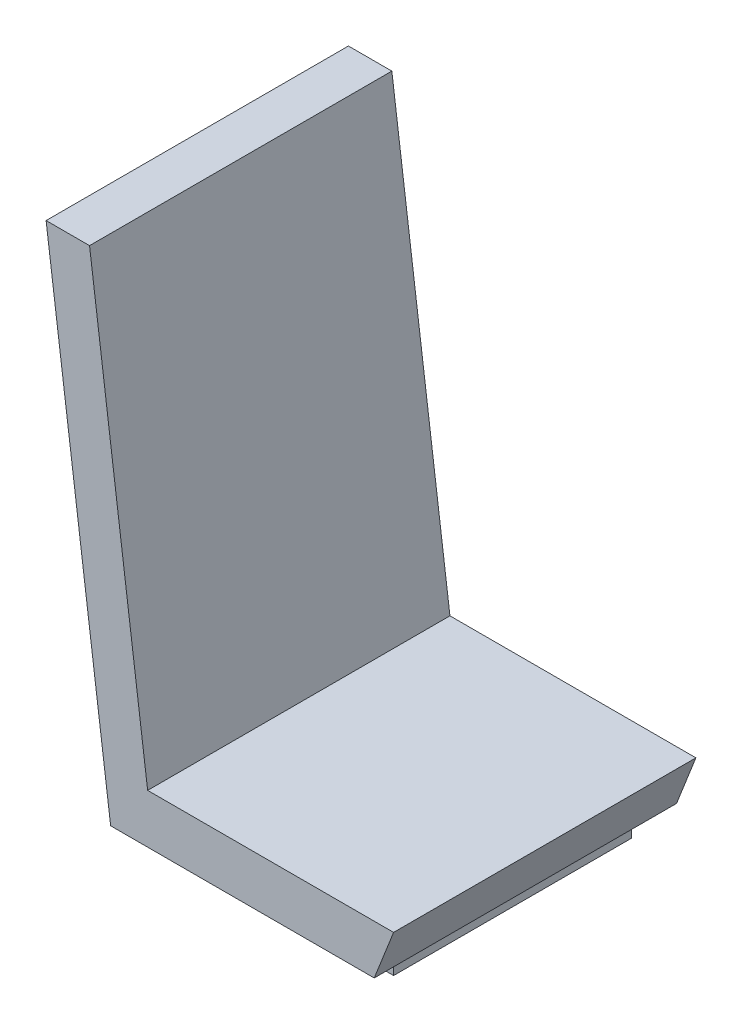
ISO-10303-21;
HEADER;
FILE_DESCRIPTION(('STEP AP214'),'2;1');
FILE_NAME('part.step','',(''),(''),'','','');
FILE_SCHEMA(('AUTOMOTIVE_DESIGN { 1 0 10303 214 1 1 1 1 }'));
ENDSEC;
DATA;
#1=APPLICATION_CONTEXT('core data for automotive mechanical design processes');
#2=APPLICATION_PROTOCOL_DEFINITION('international standard','automotive_design',2000,#1);
#3=PRODUCT_CONTEXT('',#1,'mechanical');
#4=PRODUCT('Part','Part','',(#3));
#5=PRODUCT_RELATED_PRODUCT_CATEGORY('part','',(#4));
#6=PRODUCT_DEFINITION_FORMATION('','',#4);
#7=PRODUCT_DEFINITION_CONTEXT('part definition',#1,'design');
#8=PRODUCT_DEFINITION('design','',#6,#7);
#9=PRODUCT_DEFINITION_SHAPE('','',#8);
#10=(LENGTH_UNIT() NAMED_UNIT(*) SI_UNIT(.MILLI.,.METRE.));
#11=(NAMED_UNIT(*) PLANE_ANGLE_UNIT() SI_UNIT($,.RADIAN.));
#12=(NAMED_UNIT(*) SI_UNIT($,.STERADIAN.) SOLID_ANGLE_UNIT());
#13=UNCERTAINTY_MEASURE_WITH_UNIT(LENGTH_MEASURE(1.E-05),#10,'distance_accuracy_value','');
#14=(GEOMETRIC_REPRESENTATION_CONTEXT(3) GLOBAL_UNCERTAINTY_ASSIGNED_CONTEXT((#13)) GLOBAL_UNIT_ASSIGNED_CONTEXT((#10,
#11,#12)) REPRESENTATION_CONTEXT('',''));
#15=CARTESIAN_POINT('',(0.,0.,0.));
#16=DIRECTION('',(0.,0.,1.));
#17=DIRECTION('',(1.,0.,0.));
#18=AXIS2_PLACEMENT_3D('',#15,#16,#17);
#19=CARTESIAN_POINT('',(0.,0.,368.3));
#20=DIRECTION('',(0.,1.,0.));
#21=DIRECTION('',(0.,0.,1.));
#22=AXIS2_PLACEMENT_3D('',#19,#20,#21);
#23=PLANE('',#22);
#24=DIRECTION('',(1.,0.,0.));
#25=VECTOR('',#24,1.);
#26=CARTESIAN_POINT('',(0.,0.,0.));
#27=LINE('',#26,#25);
#28=CARTESIAN_POINT('',(0.,0.,0.));
#29=VERTEX_POINT('',#28);
#30=CARTESIAN_POINT('',(368.3,0.,0.));
#31=VERTEX_POINT('',#30);
#32=EDGE_CURVE('E283',#29,#31,#27,.T.);
#33=ORIENTED_EDGE('',*,*,#32,.T.);
#34=DIRECTION('',(0.,0.,-1.));
#35=VECTOR('',#34,1.);
#36=CARTESIAN_POINT('',(368.3,0.,368.3));
#37=LINE('',#36,#35);
#38=CARTESIAN_POINT('',(368.3,0.,368.3));
#39=VERTEX_POINT('',#38);
#40=EDGE_CURVE('E54',#39,#31,#37,.T.);
#41=ORIENTED_EDGE('',*,*,#40,.F.);
#42=DIRECTION('',(1.,0.,0.));
#43=VECTOR('',#42,1.);
#44=CARTESIAN_POINT('',(0.,0.,368.3));
#45=LINE('',#44,#43);
#46=CARTESIAN_POINT('',(0.,0.,368.3));
#47=VERTEX_POINT('',#46);
#48=EDGE_CURVE('E269',#47,#39,#45,.T.);
#49=ORIENTED_EDGE('',*,*,#48,.F.);
#50=DIRECTION('',(0.,0.,-1.));
#51=VECTOR('',#50,1.);
#52=CARTESIAN_POINT('',(0.,0.,368.3));
#53=LINE('',#52,#51);
#54=EDGE_CURVE('E11',#47,#29,#53,.T.);
#55=ORIENTED_EDGE('',*,*,#54,.T.);
#56=EDGE_LOOP('',(#33,#41,#49,#55));
#57=FACE_BOUND('',#56,.T.);
#58=DIRECTION('',(1.,0.,0.));
#59=VECTOR('',#58,1.);
#60=CARTESIAN_POINT('',(0.,0.,31.75));
#61=LINE('',#60,#59);
#62=CARTESIAN_POINT('',(31.75,0.,31.75));
#63=VERTEX_POINT('',#62);
#64=CARTESIAN_POINT('',(336.55,0.,31.75));
#65=VERTEX_POINT('',#64);
#66=EDGE_CURVE('E228',#63,#65,#61,.T.);
#67=ORIENTED_EDGE('',*,*,#66,.F.);
#68=DIRECTION('',(0.,0.,-1.));
#69=VECTOR('',#68,1.);
#70=CARTESIAN_POINT('',(31.75,0.,368.3));
#71=LINE('',#70,#69);
#72=CARTESIAN_POINT('',(31.75,0.,336.55));
#73=VERTEX_POINT('',#72);
#74=EDGE_CURVE('E239',#73,#63,#71,.T.);
#75=ORIENTED_EDGE('',*,*,#74,.F.);
#76=DIRECTION('',(1.,0.,0.));
#77=VECTOR('',#76,1.);
#78=CARTESIAN_POINT('',(0.,0.,336.55));
#79=LINE('',#78,#77);
#80=CARTESIAN_POINT('',(336.55,0.,336.55));
#81=VERTEX_POINT('',#80);
#82=EDGE_CURVE('E231',#73,#81,#79,.T.);
#83=ORIENTED_EDGE('',*,*,#82,.T.);
#84=DIRECTION('',(0.,0.,-1.));
#85=VECTOR('',#84,1.);
#86=CARTESIAN_POINT('',(336.55,0.,368.3));
#87=LINE('',#86,#85);
#88=EDGE_CURVE('E243',#81,#65,#87,.T.);
#89=ORIENTED_EDGE('',*,*,#88,.T.);
#90=EDGE_LOOP('',(#67,#75,#83,#89));
#91=FACE_BOUND('',#90,.T.);
#92=ADVANCED_FACE('F45',(#57,#91),#23,.F.);
#93=CARTESIAN_POINT('',(0.,0.,368.3));
#94=DIRECTION('',(1.,0.,0.));
#95=DIRECTION('',(0.,0.,-1.));
#96=AXIS2_PLACEMENT_3D('',#93,#94,#95);
#97=PLANE('',#96);
#98=DIRECTION('',(0.,-1.,0.));
#99=VECTOR('',#98,1.);
#100=CARTESIAN_POINT('',(0.,0.,0.));
#101=LINE('',#100,#99);
#102=CARTESIAN_POINT('',(0.,31.75,0.));
#103=VERTEX_POINT('',#102);
#104=EDGE_CURVE('E242',#103,#29,#101,.T.);
#105=ORIENTED_EDGE('',*,*,#104,.T.);
#106=ORIENTED_EDGE('',*,*,#54,.F.);
#107=DIRECTION('',(0.,-1.,0.));
#108=VECTOR('',#107,1.);
#109=CARTESIAN_POINT('',(0.,0.,368.3));
#110=LINE('',#109,#108);
#111=CARTESIAN_POINT('',(0.,31.75,368.3));
#112=VERTEX_POINT('',#111);
#113=EDGE_CURVE('E265',#112,#47,#110,.T.);
#114=ORIENTED_EDGE('',*,*,#113,.F.);
#115=DIRECTION('',(0.,0.,-1.));
#116=VECTOR('',#115,1.);
#117=CARTESIAN_POINT('',(0.,31.75,368.3));
#118=LINE('',#117,#116);
#119=EDGE_CURVE('E279',#112,#103,#118,.T.);
#120=ORIENTED_EDGE('',*,*,#119,.T.);
#121=EDGE_LOOP('',(#105,#106,#114,#120));
#122=FACE_BOUND('',#121,.T.);
#123=ADVANCED_FACE('F47',(#122),#97,.F.);
#124=CARTESIAN_POINT('',(368.3,31.75,368.3));
#125=DIRECTION('',(-1.,0.,0.));
#126=DIRECTION('',(0.,0.,1.));
#127=AXIS2_PLACEMENT_3D('',#124,#125,#126);
#128=PLANE('',#127);
#129=DIRECTION('',(0.,1.,0.));
#130=VECTOR('',#129,1.);
#131=CARTESIAN_POINT('',(368.3,31.75,0.));
#132=LINE('',#131,#130);
#133=CARTESIAN_POINT('',(368.3,31.75,0.));
#134=VERTEX_POINT('',#133);
#135=EDGE_CURVE('E286',#31,#134,#132,.T.);
#136=ORIENTED_EDGE('',*,*,#135,.T.);
#137=DIRECTION('',(0.,0.,-1.));
#138=VECTOR('',#137,1.);
#139=CARTESIAN_POINT('',(368.3,31.75,368.3));
#140=LINE('',#139,#138);
#141=CARTESIAN_POINT('',(368.3,31.75,368.3));
#142=VERTEX_POINT('',#141);
#143=EDGE_CURVE('E295',#142,#134,#140,.T.);
#144=ORIENTED_EDGE('',*,*,#143,.F.);
#145=DIRECTION('',(0.,1.,0.));
#146=VECTOR('',#145,1.);
#147=CARTESIAN_POINT('',(368.3,31.75,368.3));
#148=LINE('',#147,#146);
#149=EDGE_CURVE('E273',#39,#142,#148,.T.);
#150=ORIENTED_EDGE('',*,*,#149,.F.);
#151=ORIENTED_EDGE('',*,*,#40,.T.);
#152=EDGE_LOOP('',(#136,#144,#150,#151));
#153=FACE_BOUND('',#152,.T.);
#154=ADVANCED_FACE('F304',(#153),#128,.F.);
#155=CARTESIAN_POINT('',(0.,0.,368.3));
#156=DIRECTION('',(0.,0.,-1.));
#157=DIRECTION('',(-1.,0.,0.));
#158=AXIS2_PLACEMENT_3D('',#155,#156,#157);
#159=PLANE('',#158);
#160=ORIENTED_EDGE('',*,*,#113,.T.);
#161=ORIENTED_EDGE('',*,*,#48,.T.);
#162=ORIENTED_EDGE('',*,*,#149,.T.);
#163=DIRECTION('',(-1.,0.,0.));
#164=VECTOR('',#163,1.);
#165=CARTESIAN_POINT('',(0.,31.75,368.3));
#166=LINE('',#165,#164);
#167=EDGE_CURVE('E276',#142,#112,#166,.T.);
#168=ORIENTED_EDGE('',*,*,#167,.T.);
#169=EDGE_LOOP('',(#160,#161,#162,#168));
#170=FACE_BOUND('',#169,.T.);
#171=ADVANCED_FACE('F315',(#170),#159,.F.);
#172=CARTESIAN_POINT('',(0.,0.,0.));
#173=DIRECTION('',(0.,0.,-1.));
#174=DIRECTION('',(-1.,0.,0.));
#175=AXIS2_PLACEMENT_3D('',#172,#173,#174);
#176=PLANE('',#175);
#177=ORIENTED_EDGE('',*,*,#104,.F.);
#178=DIRECTION('',(-1.,0.,0.));
#179=VECTOR('',#178,1.);
#180=CARTESIAN_POINT('',(0.,31.75,0.));
#181=LINE('',#180,#179);
#182=EDGE_CURVE('E270',#134,#103,#181,.T.);
#183=ORIENTED_EDGE('',*,*,#182,.F.);
#184=ORIENTED_EDGE('',*,*,#135,.F.);
#185=ORIENTED_EDGE('',*,*,#32,.F.);
#186=EDGE_LOOP('',(#177,#183,#184,#185));
#187=FACE_BOUND('',#186,.T.);
#188=ADVANCED_FACE('F309',(#187),#176,.T.);
#189=CARTESIAN_POINT('',(31.75,0.,368.3));
#190=DIRECTION('',(1.,0.,0.));
#191=DIRECTION('',(0.,0.,-1.));
#192=AXIS2_PLACEMENT_3D('',#189,#190,#191);
#193=PLANE('',#192);
#194=DIRECTION('',(0.,-1.,0.));
#195=VECTOR('',#194,1.);
#196=CARTESIAN_POINT('',(31.75,0.,31.75));
#197=LINE('',#196,#195);
#198=CARTESIAN_POINT('',(31.75,31.75,31.75));
#199=VERTEX_POINT('',#198);
#200=EDGE_CURVE('E213',#199,#63,#197,.T.);
#201=ORIENTED_EDGE('',*,*,#200,.F.);
#202=DIRECTION('',(0.,0.,-1.));
#203=VECTOR('',#202,1.);
#204=CARTESIAN_POINT('',(31.75,31.75,368.3));
#205=LINE('',#204,#203);
#206=CARTESIAN_POINT('',(31.75,31.75,336.55));
#207=VERTEX_POINT('',#206);
#208=EDGE_CURVE('E253',#207,#199,#205,.T.);
#209=ORIENTED_EDGE('',*,*,#208,.F.);
#210=DIRECTION('',(0.,-1.,0.));
#211=VECTOR('',#210,1.);
#212=CARTESIAN_POINT('',(31.75,0.,336.55));
#213=LINE('',#212,#211);
#214=EDGE_CURVE('E61',#207,#73,#213,.T.);
#215=ORIENTED_EDGE('',*,*,#214,.T.);
#216=ORIENTED_EDGE('',*,*,#74,.T.);
#217=EDGE_LOOP('',(#201,#209,#215,#216));
#218=FACE_BOUND('',#217,.T.);
#219=ADVANCED_FACE('F331',(#218),#193,.T.);
#220=CARTESIAN_POINT('',(336.55,31.75,368.3));
#221=DIRECTION('',(-1.,0.,0.));
#222=DIRECTION('',(0.,0.,1.));
#223=AXIS2_PLACEMENT_3D('',#220,#221,#222);
#224=PLANE('',#223);
#225=DIRECTION('',(0.,1.,0.));
#226=VECTOR('',#225,1.);
#227=CARTESIAN_POINT('',(336.55,0.,31.75));
#228=LINE('',#227,#226);
#229=CARTESIAN_POINT('',(336.55,31.75,31.75));
#230=VERTEX_POINT('',#229);
#231=EDGE_CURVE('E236',#65,#230,#228,.T.);
#232=ORIENTED_EDGE('',*,*,#231,.F.);
#233=ORIENTED_EDGE('',*,*,#88,.F.);
#234=DIRECTION('',(0.,1.,0.));
#235=VECTOR('',#234,1.);
#236=CARTESIAN_POINT('',(336.55,0.,336.55));
#237=LINE('',#236,#235);
#238=CARTESIAN_POINT('',(336.55,31.75,336.55));
#239=VERTEX_POINT('',#238);
#240=EDGE_CURVE('E233',#81,#239,#237,.T.);
#241=ORIENTED_EDGE('',*,*,#240,.T.);
#242=DIRECTION('',(0.,0.,-1.));
#243=VECTOR('',#242,1.);
#244=CARTESIAN_POINT('',(336.55,31.75,368.3));
#245=LINE('',#244,#243);
#246=EDGE_CURVE('E249',#239,#230,#245,.T.);
#247=ORIENTED_EDGE('',*,*,#246,.T.);
#248=EDGE_LOOP('',(#232,#233,#241,#247));
#249=FACE_BOUND('',#248,.T.);
#250=ADVANCED_FACE('F326',(#249),#224,.T.);
#251=CARTESIAN_POINT('',(0.,0.,336.55));
#252=DIRECTION('',(0.,0.,-1.));
#253=DIRECTION('',(-1.,0.,0.));
#254=AXIS2_PLACEMENT_3D('',#251,#252,#253);
#255=PLANE('',#254);
#256=ORIENTED_EDGE('',*,*,#214,.F.);
#257=DIRECTION('',(-1.,0.,0.));
#258=VECTOR('',#257,1.);
#259=CARTESIAN_POINT('',(0.,31.75,336.55));
#260=LINE('',#259,#258);
#261=EDGE_CURVE('E68',#239,#207,#260,.T.);
#262=ORIENTED_EDGE('',*,*,#261,.F.);
#263=ORIENTED_EDGE('',*,*,#240,.F.);
#264=ORIENTED_EDGE('',*,*,#82,.F.);
#265=EDGE_LOOP('',(#256,#262,#263,#264));
#266=FACE_BOUND('',#265,.T.);
#267=ADVANCED_FACE('F332',(#266),#255,.T.);
#268=CARTESIAN_POINT('',(0.,0.,31.75));
#269=DIRECTION('',(0.,0.,-1.));
#270=DIRECTION('',(-1.,0.,0.));
#271=AXIS2_PLACEMENT_3D('',#268,#269,#270);
#272=PLANE('',#271);
#273=ORIENTED_EDGE('',*,*,#200,.T.);
#274=ORIENTED_EDGE('',*,*,#66,.T.);
#275=ORIENTED_EDGE('',*,*,#231,.T.);
#276=DIRECTION('',(-1.,0.,0.));
#277=VECTOR('',#276,1.);
#278=CARTESIAN_POINT('',(0.,31.75,31.75));
#279=LINE('',#278,#277);
#280=EDGE_CURVE('E232',#230,#199,#279,.T.);
#281=ORIENTED_EDGE('',*,*,#280,.T.);
#282=EDGE_LOOP('',(#273,#274,#275,#281));
#283=FACE_BOUND('',#282,.T.);
#284=ADVANCED_FACE('F324',(#283),#272,.F.);
#285=CARTESIAN_POINT('',(0.,31.75,-50.));
#286=DIRECTION('',(0.,-1.,0.));
#287=DIRECTION('',(0.,0.,-1.));
#288=AXIS2_PLACEMENT_3D('',#285,#286,#287);
#289=PLANE('',#288);
#290=ORIENTED_EDGE('',*,*,#280,.F.);
#291=ORIENTED_EDGE('',*,*,#246,.F.);
#292=ORIENTED_EDGE('',*,*,#261,.T.);
#293=ORIENTED_EDGE('',*,*,#208,.T.);
#294=EDGE_LOOP('',(#290,#291,#292,#293));
#295=FACE_BOUND('',#294,.T.);
#296=ADVANCED_FACE('F330',(#295),#289,.T.);
#297=ORIENTED_EDGE('',*,*,#143,.T.);
#298=ORIENTED_EDGE('',*,*,#182,.T.);
#299=ORIENTED_EDGE('',*,*,#119,.F.);
#300=ORIENTED_EDGE('',*,*,#167,.F.);
#301=EDGE_LOOP('',(#297,#298,#299,#300));
#302=FACE_BOUND('',#301,.T.);
#303=DIRECTION('',(0.,0.,1.));
#304=VECTOR('',#303,1.);
#305=CARTESIAN_POINT('',(388.3,31.75,-50.));
#306=LINE('',#305,#304);
#307=CARTESIAN_POINT('',(388.3,31.75,-50.));
#308=VERTEX_POINT('',#307);
#309=CARTESIAN_POINT('',(388.3,31.75,418.3));
#310=VERTEX_POINT('',#309);
#311=EDGE_CURVE('E148',#308,#310,#306,.T.);
#312=ORIENTED_EDGE('',*,*,#311,.T.);
#313=DIRECTION('',(1.,0.,0.));
#314=VECTOR('',#313,1.);
#315=CARTESIAN_POINT('',(0.,31.75,418.3));
#316=LINE('',#315,#314);
#317=CARTESIAN_POINT('',(-20.,31.75,418.3));
#318=VERTEX_POINT('',#317);
#319=EDGE_CURVE('E152',#318,#310,#316,.T.);
#320=ORIENTED_EDGE('',*,*,#319,.F.);
#321=DIRECTION('',(0.,0.,1.));
#322=VECTOR('',#321,1.);
#323=CARTESIAN_POINT('',(-20.,31.75,-50.));
#324=LINE('',#323,#322);
#325=CARTESIAN_POINT('',(-20.,31.75,-50.));
#326=VERTEX_POINT('',#325);
#327=EDGE_CURVE('E210',#326,#318,#324,.T.);
#328=ORIENTED_EDGE('',*,*,#327,.F.);
#329=DIRECTION('',(1.,0.,0.));
#330=VECTOR('',#329,1.);
#331=CARTESIAN_POINT('',(0.,31.75,-50.));
#332=LINE('',#331,#330);
#333=EDGE_CURVE('E154',#326,#308,#332,.T.);
#334=ORIENTED_EDGE('',*,*,#333,.T.);
#335=EDGE_LOOP('',(#312,#320,#328,#334));
#336=FACE_BOUND('',#335,.T.);
#337=ADVANCED_FACE('F150',(#302,#336),#289,.T.);
#338=CARTESIAN_POINT('',(-20.,31.75,-50.));
#339=DIRECTION('',(-0.991498526331162,-0.13011791684136,0.));
#340=DIRECTION('',(0.13011791684136,-0.991498526331162,0.));
#341=AXIS2_PLACEMENT_3D('',#338,#339,#340);
#342=PLANE('',#341);
#343=ORIENTED_EDGE('',*,*,#327,.T.);
#344=DIRECTION('',(0.13011791684136,-0.991498526331162,0.));
#345=VECTOR('',#344,1.);
#346=CARTESIAN_POINT('',(-20.,31.75,418.3));
#347=LINE('',#346,#345);
#348=CARTESIAN_POINT('',(-120.,793.75,418.3));
#349=VERTEX_POINT('',#348);
#350=EDGE_CURVE('E171',#349,#318,#347,.T.);
#351=ORIENTED_EDGE('',*,*,#350,.F.);
#352=DIRECTION('',(0.,0.,1.));
#353=VECTOR('',#352,1.);
#354=CARTESIAN_POINT('',(-120.,793.75,-50.));
#355=LINE('',#354,#353);
#356=CARTESIAN_POINT('',(-120.,793.75,-50.));
#357=VERTEX_POINT('',#356);
#358=EDGE_CURVE('E214',#357,#349,#355,.T.);
#359=ORIENTED_EDGE('',*,*,#358,.F.);
#360=DIRECTION('',(0.13011791684136,-0.991498526331162,0.));
#361=VECTOR('',#360,1.);
#362=CARTESIAN_POINT('',(-20.,31.75,-50.));
#363=LINE('',#362,#361);
#364=EDGE_CURVE('E161',#357,#326,#363,.T.);
#365=ORIENTED_EDGE('',*,*,#364,.T.);
#366=EDGE_LOOP('',(#343,#351,#359,#365));
#367=FACE_BOUND('',#366,.T.);
#368=ADVANCED_FACE('F399',(#367),#342,.T.);
#369=CARTESIAN_POINT('',(-52.7000000000002,793.75,-50.));
#370=DIRECTION('',(0.,1.,0.));
#371=DIRECTION('',(0.,0.,1.));
#372=AXIS2_PLACEMENT_3D('',#369,#370,#371);
#373=PLANE('',#372);
#374=ORIENTED_EDGE('',*,*,#358,.T.);
#375=DIRECTION('',(-1.,0.,0.));
#376=VECTOR('',#375,1.);
#377=CARTESIAN_POINT('',(-52.7000000000002,793.75,418.3));
#378=LINE('',#377,#376);
#379=CARTESIAN_POINT('',(-52.7000000000002,793.75,418.3));
#380=VERTEX_POINT('',#379);
#381=EDGE_CURVE('E185',#380,#349,#378,.T.);
#382=ORIENTED_EDGE('',*,*,#381,.F.);
#383=DIRECTION('',(0.,0.,1.));
#384=VECTOR('',#383,1.);
#385=CARTESIAN_POINT('',(-52.7000000000002,793.75,-50.));
#386=LINE('',#385,#384);
#387=CARTESIAN_POINT('',(-52.7000000000002,793.75,-50.));
#388=VERTEX_POINT('',#387);
#389=EDGE_CURVE('E217',#388,#380,#386,.T.);
#390=ORIENTED_EDGE('',*,*,#389,.F.);
#391=DIRECTION('',(-1.,0.,0.));
#392=VECTOR('',#391,1.);
#393=CARTESIAN_POINT('',(-52.7000000000002,793.75,-50.));
#394=LINE('',#393,#392);
#395=EDGE_CURVE('E203',#388,#357,#394,.T.);
#396=ORIENTED_EDGE('',*,*,#395,.T.);
#397=EDGE_LOOP('',(#374,#382,#390,#396));
#398=FACE_BOUND('',#397,.T.);
#399=ADVANCED_FACE('F408',(#398),#373,.T.);
#400=CARTESIAN_POINT('',(37.2999999999999,107.95,-50.));
#401=DIRECTION('',(0.991498526331162,0.13011791684136,0.));
#402=DIRECTION('',(-0.13011791684136,0.991498526331162,0.));
#403=AXIS2_PLACEMENT_3D('',#400,#401,#402);
#404=PLANE('',#403);
#405=ORIENTED_EDGE('',*,*,#389,.T.);
#406=DIRECTION('',(-0.13011791684136,0.991498526331161,0.));
#407=VECTOR('',#406,1.);
#408=CARTESIAN_POINT('',(37.2999999999999,107.95,418.3));
#409=LINE('',#408,#407);
#410=CARTESIAN_POINT('',(37.2999999999999,107.95,418.3));
#411=VERTEX_POINT('',#410);
#412=EDGE_CURVE('E179',#411,#380,#409,.T.);
#413=ORIENTED_EDGE('',*,*,#412,.F.);
#414=DIRECTION('',(0.,0.,1.));
#415=VECTOR('',#414,1.);
#416=CARTESIAN_POINT('',(37.2999999999999,107.95,-50.));
#417=LINE('',#416,#415);
#418=CARTESIAN_POINT('',(37.2999999999999,107.95,-50.));
#419=VERTEX_POINT('',#418);
#420=EDGE_CURVE('E220',#419,#411,#417,.T.);
#421=ORIENTED_EDGE('',*,*,#420,.F.);
#422=DIRECTION('',(-0.13011791684136,0.991498526331161,0.));
#423=VECTOR('',#422,1.);
#424=CARTESIAN_POINT('',(37.2999999999999,107.95,-50.));
#425=LINE('',#424,#423);
#426=EDGE_CURVE('E199',#419,#388,#425,.T.);
#427=ORIENTED_EDGE('',*,*,#426,.T.);
#428=EDGE_LOOP('',(#405,#413,#421,#427));
#429=FACE_BOUND('',#428,.T.);
#430=ADVANCED_FACE('F418',(#429),#404,.T.);
#431=CARTESIAN_POINT('',(418.3,107.95,-50.));
#432=DIRECTION('',(0.,1.,0.));
#433=DIRECTION('',(-1.,0.,0.));
#434=AXIS2_PLACEMENT_3D('',#431,#432,#433);
#435=PLANE('',#434);
#436=ORIENTED_EDGE('',*,*,#420,.T.);
#437=DIRECTION('',(-1.,0.,0.));
#438=VECTOR('',#437,1.);
#439=CARTESIAN_POINT('',(418.3,107.95,418.3));
#440=LINE('',#439,#438);
#441=CARTESIAN_POINT('',(418.3,107.95,418.3));
#442=VERTEX_POINT('',#441);
#443=EDGE_CURVE('E176',#442,#411,#440,.T.);
#444=ORIENTED_EDGE('',*,*,#443,.F.);
#445=DIRECTION('',(0.,0.,1.));
#446=VECTOR('',#445,1.);
#447=CARTESIAN_POINT('',(418.3,107.95,-50.));
#448=LINE('',#447,#446);
#449=CARTESIAN_POINT('',(418.3,107.95,-50.));
#450=VERTEX_POINT('',#449);
#451=EDGE_CURVE('E160',#450,#442,#448,.T.);
#452=ORIENTED_EDGE('',*,*,#451,.F.);
#453=DIRECTION('',(-1.,0.,0.));
#454=VECTOR('',#453,1.);
#455=CARTESIAN_POINT('',(418.3,107.95,-50.));
#456=LINE('',#455,#454);
#457=EDGE_CURVE('E195',#450,#419,#456,.T.);
#458=ORIENTED_EDGE('',*,*,#457,.T.);
#459=EDGE_LOOP('',(#436,#444,#452,#458));
#460=FACE_BOUND('',#459,.T.);
#461=ADVANCED_FACE('F427',(#460),#435,.T.);
#462=CARTESIAN_POINT('',(388.3,31.75,-50.));
#463=DIRECTION('',(0.930484085528071,-0.366332317137036,0.));
#464=DIRECTION('',(0.366332317137036,0.930484085528071,0.));
#465=AXIS2_PLACEMENT_3D('',#462,#463,#464);
#466=PLANE('',#465);
#467=ORIENTED_EDGE('',*,*,#451,.T.);
#468=DIRECTION('',(0.366332317137035,0.930484085528071,0.));
#469=VECTOR('',#468,1.);
#470=CARTESIAN_POINT('',(388.3,31.75,418.3));
#471=LINE('',#470,#469);
#472=EDGE_CURVE('E167',#310,#442,#471,.T.);
#473=ORIENTED_EDGE('',*,*,#472,.F.);
#474=ORIENTED_EDGE('',*,*,#311,.F.);
#475=DIRECTION('',(0.366332317137035,0.930484085528071,0.));
#476=VECTOR('',#475,1.);
#477=CARTESIAN_POINT('',(388.3,31.75,-50.));
#478=LINE('',#477,#476);
#479=EDGE_CURVE('E192',#308,#450,#478,.T.);
#480=ORIENTED_EDGE('',*,*,#479,.T.);
#481=EDGE_LOOP('',(#467,#473,#474,#480));
#482=FACE_BOUND('',#481,.T.);
#483=ADVANCED_FACE('F174',(#482),#466,.T.);
#484=CARTESIAN_POINT('',(0.,0.,-50.));
#485=DIRECTION('',(0.,0.,1.));
#486=DIRECTION('',(1.,0.,0.));
#487=AXIS2_PLACEMENT_3D('',#484,#485,#486);
#488=PLANE('',#487);
#489=ORIENTED_EDGE('',*,*,#333,.F.);
#490=ORIENTED_EDGE('',*,*,#364,.F.);
#491=ORIENTED_EDGE('',*,*,#395,.F.);
#492=ORIENTED_EDGE('',*,*,#426,.F.);
#493=ORIENTED_EDGE('',*,*,#457,.F.);
#494=ORIENTED_EDGE('',*,*,#479,.F.);
#495=EDGE_LOOP('',(#489,#490,#491,#492,#493,#494));
#496=FACE_BOUND('',#495,.T.);
#497=ADVANCED_FACE('F444',(#496),#488,.F.);
#498=CARTESIAN_POINT('',(0.,0.,418.3));
#499=DIRECTION('',(0.,0.,1.));
#500=DIRECTION('',(1.,0.,0.));
#501=AXIS2_PLACEMENT_3D('',#498,#499,#500);
#502=PLANE('',#501);
#503=ORIENTED_EDGE('',*,*,#319,.T.);
#504=ORIENTED_EDGE('',*,*,#472,.T.);
#505=ORIENTED_EDGE('',*,*,#443,.T.);
#506=ORIENTED_EDGE('',*,*,#412,.T.);
#507=ORIENTED_EDGE('',*,*,#381,.T.);
#508=ORIENTED_EDGE('',*,*,#350,.T.);
#509=EDGE_LOOP('',(#503,#504,#505,#506,#507,#508));
#510=FACE_BOUND('',#509,.T.);
#511=ADVANCED_FACE('F165',(#510),#502,.T.);
#512=CLOSED_SHELL('',(#92,#123,#154,#171,#188,#219,#250,#267,#284,#296,#337,#368,#399,#430,#461,
#483,#497,#511));
#513=MANIFOLD_SOLID_BREP('B2',#512);
#514=ADVANCED_BREP_SHAPE_REPRESENTATION('',(#18,#513),#14);
#515=SHAPE_DEFINITION_REPRESENTATION(#9,#514);
ENDSEC;
END-ISO-10303-21;
